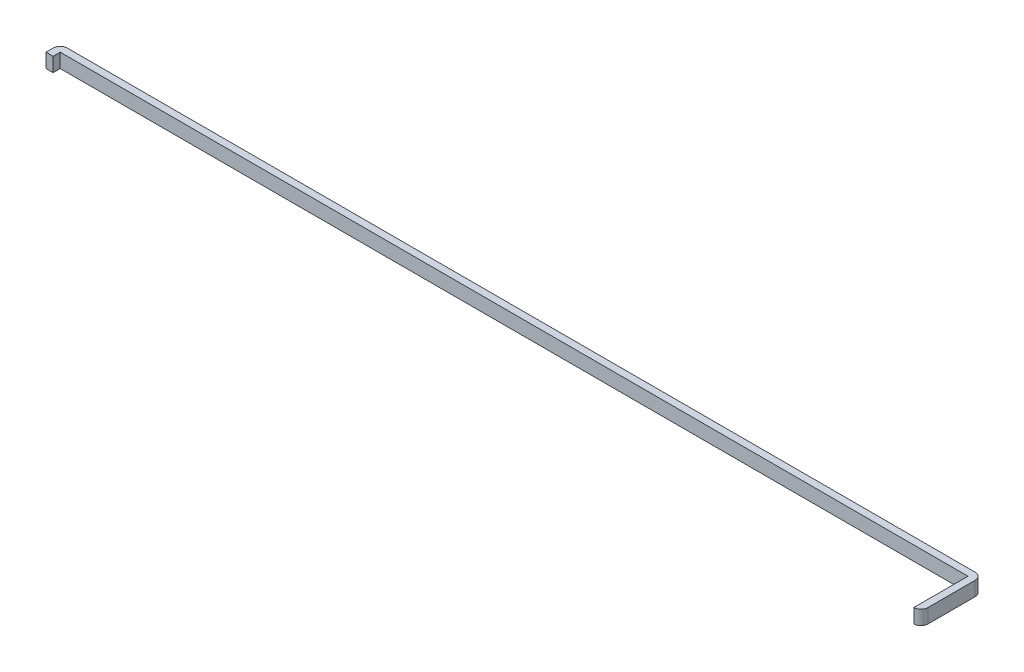
ISO-10303-21;
HEADER;
FILE_DESCRIPTION(('STEP AP214'),'2;1');
FILE_NAME('part.step','',(''),(''),'','','');
FILE_SCHEMA(('AUTOMOTIVE_DESIGN { 1 0 10303 214 1 1 1 1 }'));
ENDSEC;
DATA;
#1=APPLICATION_CONTEXT('core data for automotive mechanical design processes');
#2=APPLICATION_PROTOCOL_DEFINITION('international standard','automotive_design',2000,#1);
#3=PRODUCT_CONTEXT('',#1,'mechanical');
#4=PRODUCT('Part','Part','',(#3));
#5=PRODUCT_RELATED_PRODUCT_CATEGORY('part','',(#4));
#6=PRODUCT_DEFINITION_FORMATION('','',#4);
#7=PRODUCT_DEFINITION_CONTEXT('part definition',#1,'design');
#8=PRODUCT_DEFINITION('design','',#6,#7);
#9=PRODUCT_DEFINITION_SHAPE('','',#8);
#10=(LENGTH_UNIT() NAMED_UNIT(*) SI_UNIT(.MILLI.,.METRE.));
#11=(NAMED_UNIT(*) PLANE_ANGLE_UNIT() SI_UNIT($,.RADIAN.));
#12=(NAMED_UNIT(*) SI_UNIT($,.STERADIAN.) SOLID_ANGLE_UNIT());
#13=UNCERTAINTY_MEASURE_WITH_UNIT(LENGTH_MEASURE(1.E-05),#10,'distance_accuracy_value','');
#14=(GEOMETRIC_REPRESENTATION_CONTEXT(3) GLOBAL_UNCERTAINTY_ASSIGNED_CONTEXT((#13)) GLOBAL_UNIT_ASSIGNED_CONTEXT((#10,
#11,#12)) REPRESENTATION_CONTEXT('',''));
#15=CARTESIAN_POINT('',(0.,0.,0.));
#16=DIRECTION('',(0.,0.,1.));
#17=DIRECTION('',(1.,0.,0.));
#18=AXIS2_PLACEMENT_3D('',#15,#16,#17);
#19=CARTESIAN_POINT('',(-12.766,-6.60619,0.20019));
#20=DIRECTION('',(0.,0.,-1.));
#21=DIRECTION('',(-1.,0.,0.));
#22=AXIS2_PLACEMENT_3D('',#19,#20,#21);
#23=PLANE('',#22);
#24=DIRECTION('',(0.,1.,0.));
#25=VECTOR('',#24,1.);
#26=CARTESIAN_POINT('',(12.776,-6.60619,0.20019));
#27=LINE('',#26,#25);
#28=CARTESIAN_POINT('',(12.776,-6.60619,0.20019));
#29=VERTEX_POINT('',#28);
#30=CARTESIAN_POINT('',(12.776,-6.20581,0.20019));
#31=VERTEX_POINT('',#30);
#32=EDGE_CURVE('E125',#29,#31,#27,.T.);
#33=ORIENTED_EDGE('',*,*,#32,.T.);
#34=DIRECTION('',(1.,0.,0.));
#35=VECTOR('',#34,1.);
#36=CARTESIAN_POINT('',(12.776,-6.20581,0.20019));
#37=LINE('',#36,#35);
#38=CARTESIAN_POINT('',(-12.766,-6.20581,0.20019));
#39=VERTEX_POINT('',#38);
#40=EDGE_CURVE('E112',#31,#39,#37,.F.);
#41=ORIENTED_EDGE('',*,*,#40,.T.);
#42=DIRECTION('',(0.,1.,0.));
#43=VECTOR('',#42,1.);
#44=CARTESIAN_POINT('',(-12.766,-6.60619,0.20019));
#45=LINE('',#44,#43);
#46=CARTESIAN_POINT('',(-12.766,-6.60619,0.20019));
#47=VERTEX_POINT('',#46);
#48=EDGE_CURVE('E108',#39,#47,#45,.F.);
#49=ORIENTED_EDGE('',*,*,#48,.T.);
#50=DIRECTION('',(1.,0.,0.));
#51=VECTOR('',#50,1.);
#52=CARTESIAN_POINT('',(12.776,-6.60619,0.20019));
#53=LINE('',#52,#51);
#54=EDGE_CURVE('E126',#29,#47,#53,.F.);
#55=ORIENTED_EDGE('',*,*,#54,.F.);
#56=EDGE_LOOP('',(#33,#41,#49,#55));
#57=FACE_BOUND('',#56,.T.);
#58=ADVANCED_FACE('F17',(#57),#23,.F.);
#59=CARTESIAN_POINT('',(-12.766,-6.60619,0.40038));
#60=DIRECTION('',(-1.,0.,0.));
#61=DIRECTION('',(0.,0.,1.));
#62=AXIS2_PLACEMENT_3D('',#59,#60,#61);
#63=PLANE('',#62);
#64=ORIENTED_EDGE('',*,*,#48,.F.);
#65=DIRECTION('',(0.,0.,-1.));
#66=VECTOR('',#65,1.);
#67=CARTESIAN_POINT('',(-12.766,-6.20581,0.20019));
#68=LINE('',#67,#66);
#69=CARTESIAN_POINT('',(-12.766,-6.20581,0.40038));
#70=VERTEX_POINT('',#69);
#71=EDGE_CURVE('E120',#39,#70,#68,.F.);
#72=ORIENTED_EDGE('',*,*,#71,.T.);
#73=DIRECTION('',(0.,1.,0.));
#74=VECTOR('',#73,1.);
#75=CARTESIAN_POINT('',(-12.766,-6.60619,0.40038));
#76=LINE('',#75,#74);
#77=CARTESIAN_POINT('',(-12.766,-6.60619,0.40038));
#78=VERTEX_POINT('',#77);
#79=EDGE_CURVE('E177',#70,#78,#76,.F.);
#80=ORIENTED_EDGE('',*,*,#79,.T.);
#81=DIRECTION('',(0.,0.,-1.));
#82=VECTOR('',#81,1.);
#83=CARTESIAN_POINT('',(-12.766,-6.60619,0.20019));
#84=LINE('',#83,#82);
#85=EDGE_CURVE('E168',#47,#78,#84,.F.);
#86=ORIENTED_EDGE('',*,*,#85,.F.);
#87=EDGE_LOOP('',(#64,#72,#80,#86));
#88=FACE_BOUND('',#87,.T.);
#89=ADVANCED_FACE('F227',(#88),#63,.F.);
#90=CARTESIAN_POINT('',(-12.96619,-6.60619,0.40038));
#91=DIRECTION('',(0.,0.,-1.));
#92=DIRECTION('',(-1.,0.,0.));
#93=AXIS2_PLACEMENT_3D('',#90,#91,#92);
#94=PLANE('',#93);
#95=ORIENTED_EDGE('',*,*,#79,.F.);
#96=DIRECTION('',(1.,0.,0.));
#97=VECTOR('',#96,1.);
#98=CARTESIAN_POINT('',(12.776,-6.20581,0.40038));
#99=LINE('',#98,#97);
#100=CARTESIAN_POINT('',(-12.96619,-6.20581,0.40038));
#101=VERTEX_POINT('',#100);
#102=EDGE_CURVE('E145',#70,#101,#99,.F.);
#103=ORIENTED_EDGE('',*,*,#102,.T.);
#104=DIRECTION('',(0.,1.,0.));
#105=VECTOR('',#104,1.);
#106=CARTESIAN_POINT('',(-12.96619,-6.60619,0.40038));
#107=LINE('',#106,#105);
#108=CARTESIAN_POINT('',(-12.96619,-6.60619,0.40038));
#109=VERTEX_POINT('',#108);
#110=EDGE_CURVE('E184',#101,#109,#107,.F.);
#111=ORIENTED_EDGE('',*,*,#110,.T.);
#112=DIRECTION('',(1.,0.,0.));
#113=VECTOR('',#112,1.);
#114=CARTESIAN_POINT('',(12.776,-6.60619,0.40038));
#115=LINE('',#114,#113);
#116=EDGE_CURVE('E86',#78,#109,#115,.F.);
#117=ORIENTED_EDGE('',*,*,#116,.F.);
#118=EDGE_LOOP('',(#95,#103,#111,#117));
#119=FACE_BOUND('',#118,.T.);
#120=ADVANCED_FACE('F226',(#119),#94,.F.);
#121=CARTESIAN_POINT('',(-12.96619,-6.60619,0.20019));
#122=DIRECTION('',(1.,0.,0.));
#123=DIRECTION('',(0.,0.,-1.));
#124=AXIS2_PLACEMENT_3D('',#121,#122,#123);
#125=PLANE('',#124);
#126=ORIENTED_EDGE('',*,*,#110,.F.);
#127=DIRECTION('',(0.,0.,-1.));
#128=VECTOR('',#127,1.);
#129=CARTESIAN_POINT('',(-12.96619,-6.20581,0.20019));
#130=LINE('',#129,#128);
#131=CARTESIAN_POINT('',(-12.96619,-6.20581,0.20019));
#132=VERTEX_POINT('',#131);
#133=EDGE_CURVE('E148',#101,#132,#130,.T.);
#134=ORIENTED_EDGE('',*,*,#133,.T.);
#135=DIRECTION('',(0.,-1.,0.));
#136=VECTOR('',#135,1.);
#137=CARTESIAN_POINT('',(-12.96619,-6.60619,0.20019));
#138=LINE('',#137,#136);
#139=CARTESIAN_POINT('',(-12.96619,-6.60619,0.20019));
#140=VERTEX_POINT('',#139);
#141=EDGE_CURVE('E134',#140,#132,#138,.F.);
#142=ORIENTED_EDGE('',*,*,#141,.F.);
#143=DIRECTION('',(0.,0.,-1.));
#144=VECTOR('',#143,1.);
#145=CARTESIAN_POINT('',(-12.96619,-6.60619,0.20019));
#146=LINE('',#145,#144);
#147=EDGE_CURVE('E80',#109,#140,#146,.T.);
#148=ORIENTED_EDGE('',*,*,#147,.F.);
#149=EDGE_LOOP('',(#126,#134,#142,#148));
#150=FACE_BOUND('',#149,.T.);
#151=ADVANCED_FACE('F224',(#150),#125,.F.);
#152=CARTESIAN_POINT('',(12.97619,-6.60619,1.524905));
#153=DIRECTION('',(-1.,0.,0.));
#154=DIRECTION('',(0.,0.,1.));
#155=AXIS2_PLACEMENT_3D('',#152,#153,#154);
#156=PLANE('',#155);
#157=DIRECTION('',(0.,-1.,0.));
#158=VECTOR('',#157,1.);
#159=CARTESIAN_POINT('',(12.97619,-6.60619,0.20019));
#160=LINE('',#159,#158);
#161=CARTESIAN_POINT('',(12.97619,-6.20581,0.20019));
#162=VERTEX_POINT('',#161);
#163=CARTESIAN_POINT('',(12.97619,-6.60619,0.20019));
#164=VERTEX_POINT('',#163);
#165=EDGE_CURVE('E74',#162,#164,#160,.T.);
#166=ORIENTED_EDGE('',*,*,#165,.F.);
#167=DIRECTION('',(0.,0.,-1.));
#168=VECTOR('',#167,1.);
#169=CARTESIAN_POINT('',(12.97619,-6.20581,0.20019));
#170=LINE('',#169,#168);
#171=CARTESIAN_POINT('',(12.97619,-6.20581,1.524905));
#172=VERTEX_POINT('',#171);
#173=EDGE_CURVE('E139',#162,#172,#170,.F.);
#174=ORIENTED_EDGE('',*,*,#173,.T.);
#175=DIRECTION('',(0.,-1.,0.));
#176=VECTOR('',#175,1.);
#177=CARTESIAN_POINT('',(12.97619,-6.60619,1.524905));
#178=LINE('',#177,#176);
#179=CARTESIAN_POINT('',(12.97619,-6.60619,1.524905));
#180=VERTEX_POINT('',#179);
#181=EDGE_CURVE('E190',#180,#172,#178,.F.);
#182=ORIENTED_EDGE('',*,*,#181,.F.);
#183=DIRECTION('',(0.,0.,-1.));
#184=VECTOR('',#183,1.);
#185=CARTESIAN_POINT('',(12.97619,-6.60619,0.20019));
#186=LINE('',#185,#184);
#187=EDGE_CURVE('E160',#164,#180,#186,.F.);
#188=ORIENTED_EDGE('',*,*,#187,.F.);
#189=EDGE_LOOP('',(#166,#174,#182,#188));
#190=FACE_BOUND('',#189,.T.);
#191=ADVANCED_FACE('F216',(#190),#156,.F.);
#192=CARTESIAN_POINT('',(12.776,-6.60619,1.524905));
#193=DIRECTION('',(0.,-1.,0.));
#194=DIRECTION('',(0.,0.,-1.));
#195=AXIS2_PLACEMENT_3D('',#192,#193,#194);
#196=CYLINDRICAL_SURFACE('',#195,0.20019);
#197=CARTESIAN_POINT('',(12.776,-6.20581,1.524905));
#198=DIRECTION('',(0.,-1.,0.));
#199=DIRECTION('',(0.,0.,-1.));
#200=AXIS2_PLACEMENT_3D('',#197,#198,#199);
#201=CIRCLE('',#200,0.20019);
#202=CARTESIAN_POINT('',(12.776,-6.20581,1.725095));
#203=VERTEX_POINT('',#202);
#204=EDGE_CURVE('E135',#172,#203,#201,.T.);
#205=ORIENTED_EDGE('',*,*,#204,.T.);
#206=DIRECTION('',(0.,1.,0.));
#207=VECTOR('',#206,1.);
#208=CARTESIAN_POINT('',(12.776,-6.60619,1.725095));
#209=LINE('',#208,#207);
#210=CARTESIAN_POINT('',(12.776,-6.60619,1.725095));
#211=VERTEX_POINT('',#210);
#212=EDGE_CURVE('E129',#203,#211,#209,.F.);
#213=ORIENTED_EDGE('',*,*,#212,.T.);
#214=CARTESIAN_POINT('',(12.776,-6.60619,1.524905));
#215=DIRECTION('',(0.,-1.,0.));
#216=DIRECTION('',(0.,0.,-1.));
#217=AXIS2_PLACEMENT_3D('',#214,#215,#216);
#218=CIRCLE('',#217,0.20019);
#219=EDGE_CURVE('E156',#180,#211,#218,.T.);
#220=ORIENTED_EDGE('',*,*,#219,.F.);
#221=ORIENTED_EDGE('',*,*,#181,.T.);
#222=EDGE_LOOP('',(#205,#213,#220,#221));
#223=FACE_BOUND('',#222,.T.);
#224=ADVANCED_FACE('F218',(#223),#196,.T.);
#225=CARTESIAN_POINT('',(12.776,-6.60619,0.20019));
#226=DIRECTION('',(1.,0.,0.));
#227=DIRECTION('',(0.,0.,-1.));
#228=AXIS2_PLACEMENT_3D('',#225,#226,#227);
#229=PLANE('',#228);
#230=DIRECTION('',(0.,0.,-1.));
#231=VECTOR('',#230,1.);
#232=CARTESIAN_POINT('',(12.776,-6.60619,0.20019));
#233=LINE('',#232,#231);
#234=EDGE_CURVE('E159',#211,#29,#233,.T.);
#235=ORIENTED_EDGE('',*,*,#234,.F.);
#236=ORIENTED_EDGE('',*,*,#212,.F.);
#237=DIRECTION('',(0.,0.,-1.));
#238=VECTOR('',#237,1.);
#239=CARTESIAN_POINT('',(12.776,-6.20581,0.20019));
#240=LINE('',#239,#238);
#241=EDGE_CURVE('E117',#203,#31,#240,.T.);
#242=ORIENTED_EDGE('',*,*,#241,.T.);
#243=ORIENTED_EDGE('',*,*,#32,.F.);
#244=EDGE_LOOP('',(#235,#236,#242,#243));
#245=FACE_BOUND('',#244,.T.);
#246=ADVANCED_FACE('F131',(#245),#229,.F.);
#247=CARTESIAN_POINT('',(12.776,-6.60619,0.20019));
#248=DIRECTION('',(0.,-1.,0.));
#249=DIRECTION('',(0.,0.,-1.));
#250=AXIS2_PLACEMENT_3D('',#247,#248,#249);
#251=CYLINDRICAL_SURFACE('',#250,0.20019);
#252=CARTESIAN_POINT('',(12.776,-6.20581,0.20019));
#253=DIRECTION('',(0.,-1.,0.));
#254=DIRECTION('',(0.,0.,-1.));
#255=AXIS2_PLACEMENT_3D('',#252,#253,#254);
#256=CIRCLE('',#255,0.20019);
#257=CARTESIAN_POINT('',(12.776,-6.20581,0.));
#258=VERTEX_POINT('',#257);
#259=EDGE_CURVE('E20',#258,#162,#256,.T.);
#260=ORIENTED_EDGE('',*,*,#259,.T.);
#261=ORIENTED_EDGE('',*,*,#165,.T.);
#262=CARTESIAN_POINT('',(12.776,-6.60619,0.20019));
#263=DIRECTION('',(0.,-1.,0.));
#264=DIRECTION('',(0.,0.,-1.));
#265=AXIS2_PLACEMENT_3D('',#262,#263,#264);
#266=CIRCLE('',#265,0.20019);
#267=CARTESIAN_POINT('',(12.776,-6.60619,0.));
#268=VERTEX_POINT('',#267);
#269=EDGE_CURVE('E161',#268,#164,#266,.T.);
#270=ORIENTED_EDGE('',*,*,#269,.F.);
#271=DIRECTION('',(0.,1.,0.));
#272=VECTOR('',#271,1.);
#273=CARTESIAN_POINT('',(12.776,-6.60619,0.));
#274=LINE('',#273,#272);
#275=EDGE_CURVE('E64',#268,#258,#274,.T.);
#276=ORIENTED_EDGE('',*,*,#275,.T.);
#277=EDGE_LOOP('',(#260,#261,#270,#276));
#278=FACE_BOUND('',#277,.T.);
#279=ADVANCED_FACE('F219',(#278),#251,.T.);
#280=CARTESIAN_POINT('',(12.776,-6.20581,0.20019));
#281=DIRECTION('',(0.,-1.,0.));
#282=DIRECTION('',(0.,0.,-1.));
#283=AXIS2_PLACEMENT_3D('',#280,#281,#282);
#284=PLANE('',#283);
#285=ORIENTED_EDGE('',*,*,#241,.F.);
#286=ORIENTED_EDGE('',*,*,#204,.F.);
#287=ORIENTED_EDGE('',*,*,#173,.F.);
#288=ORIENTED_EDGE('',*,*,#259,.F.);
#289=DIRECTION('',(1.,0.,0.));
#290=VECTOR('',#289,1.);
#291=CARTESIAN_POINT('',(12.776,-6.20581,0.));
#292=LINE('',#291,#290);
#293=CARTESIAN_POINT('',(-12.766,-6.20581,0.));
#294=VERTEX_POINT('',#293);
#295=EDGE_CURVE('E204',#258,#294,#292,.F.);
#296=ORIENTED_EDGE('',*,*,#295,.T.);
#297=CARTESIAN_POINT('',(-12.766,-6.20581,0.20019));
#298=DIRECTION('',(0.,-1.,0.));
#299=DIRECTION('',(0.,0.,-1.));
#300=AXIS2_PLACEMENT_3D('',#297,#298,#299);
#301=CIRCLE('',#300,0.20019);
#302=EDGE_CURVE('E137',#132,#294,#301,.T.);
#303=ORIENTED_EDGE('',*,*,#302,.F.);
#304=ORIENTED_EDGE('',*,*,#133,.F.);
#305=ORIENTED_EDGE('',*,*,#102,.F.);
#306=ORIENTED_EDGE('',*,*,#71,.F.);
#307=ORIENTED_EDGE('',*,*,#40,.F.);
#308=EDGE_LOOP('',(#285,#286,#287,#288,#296,#303,#304,#305,#306,#307));
#309=FACE_BOUND('',#308,.T.);
#310=ADVANCED_FACE('F114',(#309),#284,.F.);
#311=CARTESIAN_POINT('',(-12.766,-6.60619,0.20019));
#312=DIRECTION('',(0.,-1.,0.));
#313=DIRECTION('',(0.,0.,-1.));
#314=AXIS2_PLACEMENT_3D('',#311,#312,#313);
#315=CYLINDRICAL_SURFACE('',#314,0.20019);
#316=ORIENTED_EDGE('',*,*,#302,.T.);
#317=DIRECTION('',(0.,1.,0.));
#318=VECTOR('',#317,1.);
#319=CARTESIAN_POINT('',(-12.766,-6.60619,0.));
#320=LINE('',#319,#318);
#321=CARTESIAN_POINT('',(-12.766,-6.60619,0.));
#322=VERTEX_POINT('',#321);
#323=EDGE_CURVE('E26',#294,#322,#320,.F.);
#324=ORIENTED_EDGE('',*,*,#323,.T.);
#325=CARTESIAN_POINT('',(-12.766,-6.60619,0.20019));
#326=DIRECTION('',(0.,-1.,0.));
#327=DIRECTION('',(0.,0.,-1.));
#328=AXIS2_PLACEMENT_3D('',#325,#326,#327);
#329=CIRCLE('',#328,0.20019);
#330=EDGE_CURVE('E34',#140,#322,#329,.T.);
#331=ORIENTED_EDGE('',*,*,#330,.F.);
#332=ORIENTED_EDGE('',*,*,#141,.T.);
#333=EDGE_LOOP('',(#316,#324,#331,#332));
#334=FACE_BOUND('',#333,.T.);
#335=ADVANCED_FACE('F221',(#334),#315,.T.);
#336=CARTESIAN_POINT('',(12.776,-6.60619,0.20019));
#337=DIRECTION('',(0.,-1.,0.));
#338=DIRECTION('',(0.,0.,-1.));
#339=AXIS2_PLACEMENT_3D('',#336,#337,#338);
#340=PLANE('',#339);
#341=ORIENTED_EDGE('',*,*,#219,.T.);
#342=ORIENTED_EDGE('',*,*,#234,.T.);
#343=ORIENTED_EDGE('',*,*,#54,.T.);
#344=ORIENTED_EDGE('',*,*,#85,.T.);
#345=ORIENTED_EDGE('',*,*,#116,.T.);
#346=ORIENTED_EDGE('',*,*,#147,.T.);
#347=ORIENTED_EDGE('',*,*,#330,.T.);
#348=DIRECTION('',(1.,0.,0.));
#349=VECTOR('',#348,1.);
#350=CARTESIAN_POINT('',(12.776,-6.60619,0.));
#351=LINE('',#350,#349);
#352=EDGE_CURVE('E11',#322,#268,#351,.T.);
#353=ORIENTED_EDGE('',*,*,#352,.T.);
#354=ORIENTED_EDGE('',*,*,#269,.T.);
#355=ORIENTED_EDGE('',*,*,#187,.T.);
#356=EDGE_LOOP('',(#341,#342,#343,#344,#345,#346,#347,#353,#354,#355));
#357=FACE_BOUND('',#356,.T.);
#358=ADVANCED_FACE('F213',(#357),#340,.T.);
#359=CARTESIAN_POINT('',(12.776,-6.60619,0.));
#360=DIRECTION('',(0.,0.,1.));
#361=DIRECTION('',(1.,0.,0.));
#362=AXIS2_PLACEMENT_3D('',#359,#360,#361);
#363=PLANE('',#362);
#364=ORIENTED_EDGE('',*,*,#323,.F.);
#365=ORIENTED_EDGE('',*,*,#295,.F.);
#366=ORIENTED_EDGE('',*,*,#275,.F.);
#367=ORIENTED_EDGE('',*,*,#352,.F.);
#368=EDGE_LOOP('',(#364,#365,#366,#367));
#369=FACE_BOUND('',#368,.T.);
#370=ADVANCED_FACE('F220',(#369),#363,.F.);
#371=CLOSED_SHELL('',(#58,#89,#120,#151,#191,#224,#246,#279,#310,#335,#358,#370));
#372=MANIFOLD_SOLID_BREP('B1',#371);
#373=ADVANCED_BREP_SHAPE_REPRESENTATION('',(#18,#372),#14);
#374=SHAPE_DEFINITION_REPRESENTATION(#9,#373);
ENDSEC;
END-ISO-10303-21;
